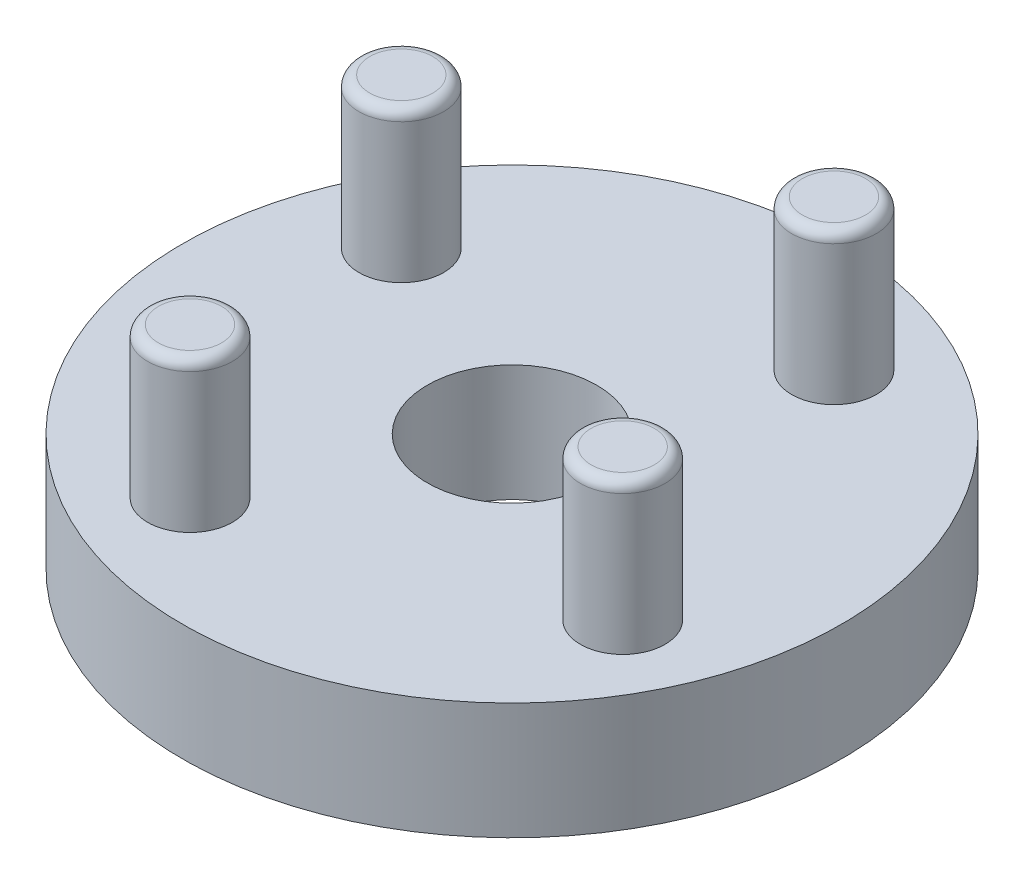
ISO-10303-21;
HEADER;
FILE_DESCRIPTION(('STEP AP214'),'2;1');
FILE_NAME('part.step','',(''),(''),'','','');
FILE_SCHEMA(('AUTOMOTIVE_DESIGN { 1 0 10303 214 1 1 1 1 }'));
ENDSEC;
DATA;
#1=APPLICATION_CONTEXT('core data for automotive mechanical design processes');
#2=APPLICATION_PROTOCOL_DEFINITION('international standard','automotive_design',2000,#1);
#3=PRODUCT_CONTEXT('',#1,'mechanical');
#4=PRODUCT('Part','Part','',(#3));
#5=PRODUCT_RELATED_PRODUCT_CATEGORY('part','',(#4));
#6=PRODUCT_DEFINITION_FORMATION('','',#4);
#7=PRODUCT_DEFINITION_CONTEXT('part definition',#1,'design');
#8=PRODUCT_DEFINITION('design','',#6,#7);
#9=PRODUCT_DEFINITION_SHAPE('','',#8);
#10=(LENGTH_UNIT() NAMED_UNIT(*) SI_UNIT(.MILLI.,.METRE.));
#11=(NAMED_UNIT(*) PLANE_ANGLE_UNIT() SI_UNIT($,.RADIAN.));
#12=(NAMED_UNIT(*) SI_UNIT($,.STERADIAN.) SOLID_ANGLE_UNIT());
#13=UNCERTAINTY_MEASURE_WITH_UNIT(LENGTH_MEASURE(1.E-05),#10,'distance_accuracy_value','');
#14=(GEOMETRIC_REPRESENTATION_CONTEXT(3) GLOBAL_UNCERTAINTY_ASSIGNED_CONTEXT((#13)) GLOBAL_UNIT_ASSIGNED_CONTEXT((#10,
#11,#12)) REPRESENTATION_CONTEXT('',''));
#15=CARTESIAN_POINT('',(0.,0.,0.));
#16=DIRECTION('',(0.,0.,1.));
#17=DIRECTION('',(1.,0.,0.));
#18=AXIS2_PLACEMENT_3D('',#15,#16,#17);
#19=CARTESIAN_POINT('',(35.0287277843954,26.2000967137347,35.8945010467193));
#20=DIRECTION('',(0.,1.,0.));
#21=DIRECTION('',(1.,0.,0.));
#22=AXIS2_PLACEMENT_3D('',#19,#20,#21);
#23=PLANE('',#22);
#24=CARTESIAN_POINT('',(35.0287277845122,26.2000967139887,35.8945010470589));
#25=DIRECTION('',(0.,1.,0.));
#26=DIRECTION('',(-0.89859436733959,0.,-0.438780312896513));
#27=AXIS2_PLACEMENT_3D('',#24,#25,#26);
#28=CIRCLE('',#27,1.492250000254);
#29=CARTESIAN_POINT('',(33.6878003396215,26.2000967139887,35.2397311250277));
#30=VERTEX_POINT('',#29);
#31=EDGE_CURVE('E99',#30,#30,#28,.T.);
#32=ORIENTED_EDGE('',*,*,#31,.T.);
#33=EDGE_LOOP('',(#32));
#34=FACE_BOUND('',#33,.T.);
#35=ADVANCED_FACE('F17',(#34),#23,.T.);
#36=CARTESIAN_POINT('',(29.8022513345682,26.2000967137347,20.6932317438155));
#37=DIRECTION('',(0.,1.,0.));
#38=DIRECTION('',(1.,0.,0.));
#39=AXIS2_PLACEMENT_3D('',#36,#37,#38);
#40=PLANE('',#39);
#41=CARTESIAN_POINT('',(29.8022513346797,26.2000967139887,20.6932317435873));
#42=DIRECTION('',(0.,1.,0.));
#43=DIRECTION('',(-0.89859436733959,0.,-0.438780312896513));
#44=AXIS2_PLACEMENT_3D('',#41,#42,#43);
#45=CIRCLE('',#44,1.492250000254);
#46=CARTESIAN_POINT('',(28.461323889789,26.2000967139887,20.038461821556));
#47=VERTEX_POINT('',#46);
#48=EDGE_CURVE('E108',#47,#47,#45,.T.);
#49=ORIENTED_EDGE('',*,*,#48,.T.);
#50=EDGE_LOOP('',(#49));
#51=FACE_BOUND('',#50,.T.);
#52=ADVANCED_FACE('F308',(#51),#40,.T.);
#53=CARTESIAN_POINT('',(14.6009820316646,26.2000967137347,25.9197081936427));
#54=DIRECTION('',(0.,1.,0.));
#55=DIRECTION('',(1.,0.,0.));
#56=AXIS2_PLACEMENT_3D('',#53,#54,#55);
#57=PLANE('',#56);
#58=CARTESIAN_POINT('',(14.6009820315478,26.2000967139887,25.919708193303));
#59=DIRECTION('',(0.,1.,0.));
#60=DIRECTION('',(-0.89859436733959,0.,-0.438780312896513));
#61=AXIS2_PLACEMENT_3D('',#58,#59,#60);
#62=CIRCLE('',#61,1.492250000254);
#63=CARTESIAN_POINT('',(13.2600545866571,26.2000967139887,25.2649382712717));
#64=VERTEX_POINT('',#63);
#65=EDGE_CURVE('E125',#64,#64,#62,.T.);
#66=ORIENTED_EDGE('',*,*,#65,.T.);
#67=EDGE_LOOP('',(#66));
#68=FACE_BOUND('',#67,.T.);
#69=ADVANCED_FACE('F299',(#68),#57,.T.);
#70=CARTESIAN_POINT('',(19.8274584814918,26.2000967137347,41.1209774965464));
#71=DIRECTION('',(0.,1.,0.));
#72=DIRECTION('',(1.,0.,0.));
#73=AXIS2_PLACEMENT_3D('',#70,#71,#72);
#74=PLANE('',#73);
#75=CARTESIAN_POINT('',(19.8274584813804,26.2000967139887,41.1209774967747));
#76=DIRECTION('',(0.,1.,0.));
#77=DIRECTION('',(-0.89859436733959,0.,-0.438780312896513));
#78=AXIS2_PLACEMENT_3D('',#75,#76,#77);
#79=CIRCLE('',#78,1.492250000254);
#80=CARTESIAN_POINT('',(18.4865310364897,26.2000967139887,40.4662075747434));
#81=VERTEX_POINT('',#80);
#82=EDGE_CURVE('E114',#81,#81,#79,.T.);
#83=ORIENTED_EDGE('',*,*,#82,.T.);
#84=EDGE_LOOP('',(#83));
#85=FACE_BOUND('',#84,.T.);
#86=ADVANCED_FACE('F288',(#85),#74,.T.);
#87=CARTESIAN_POINT('',(24.81485490803,13.6054968077347,30.9071046201809));
#88=DIRECTION('',(0.,1.,0.));
#89=DIRECTION('',(1.,0.,0.));
#90=AXIS2_PLACEMENT_3D('',#87,#88,#89);
#91=PLANE('',#90);
#92=CARTESIAN_POINT('',(24.81485490803,13.6054968077347,30.9071046201809));
#93=DIRECTION('',(0.,1.,0.));
#94=DIRECTION('',(-0.89859436733959,0.,-0.438780312896513));
#95=AXIS2_PLACEMENT_3D('',#92,#93,#94);
#96=CIRCLE('',#95,4.000000000254);
#97=CARTESIAN_POINT('',(21.2204774384434,13.6054968077347,29.1519833684834));
#98=VERTEX_POINT('',#97);
#99=EDGE_CURVE('E140',#98,#98,#96,.T.);
#100=ORIENTED_EDGE('',*,*,#99,.T.);
#101=EDGE_LOOP('',(#100));
#102=FACE_BOUND('',#101,.T.);
#103=CARTESIAN_POINT('',(24.81485490803,13.6054968077347,30.9071046201809));
#104=DIRECTION('',(0.,1.,0.));
#105=DIRECTION('',(-0.89859436733959,0.,-0.438780312896513));
#106=AXIS2_PLACEMENT_3D('',#103,#104,#105);
#107=CIRCLE('',#106,15.557500000254);
#108=CARTESIAN_POINT('',(10.8349730379161,13.6054968077347,24.080779902182));
#109=VERTEX_POINT('',#108);
#110=EDGE_CURVE('E20',#109,#109,#107,.T.);
#111=ORIENTED_EDGE('',*,*,#110,.F.);
#112=EDGE_LOOP('',(#111));
#113=FACE_BOUND('',#112,.T.);
#114=ADVANCED_FACE('F276',(#102,#113),#91,.F.);
#115=CARTESIAN_POINT('',(24.81485490803,19.1134967137347,30.9071046201809));
#116=DIRECTION('',(0.,1.,0.));
#117=DIRECTION('',(1.,0.,0.));
#118=AXIS2_PLACEMENT_3D('',#115,#116,#117);
#119=PLANE('',#118);
#120=CARTESIAN_POINT('',(24.81485490803,19.1134967139887,30.9071046201809));
#121=DIRECTION('',(0.,1.,0.));
#122=DIRECTION('',(-0.89859436733959,0.,-0.438780312896513));
#123=AXIS2_PLACEMENT_3D('',#120,#121,#122);
#124=CIRCLE('',#123,4.000000000254);
#125=CARTESIAN_POINT('',(21.2204774384434,19.1134967139887,29.1519833684834));
#126=VERTEX_POINT('',#125);
#127=EDGE_CURVE('E142',#126,#126,#124,.T.);
#128=ORIENTED_EDGE('',*,*,#127,.F.);
#129=EDGE_LOOP('',(#128));
#130=FACE_BOUND('',#129,.T.);
#131=CARTESIAN_POINT('',(19.8274584813804,19.1134967139887,41.1209774967747));
#132=DIRECTION('',(0.,1.,0.));
#133=DIRECTION('',(-0.89859436733959,0.,-0.438780312896513));
#134=AXIS2_PLACEMENT_3D('',#131,#132,#133);
#135=CIRCLE('',#134,2.000250000254);
#136=CARTESIAN_POINT('',(18.0300450978811,19.1134967139887,40.2433071757919));
#137=VERTEX_POINT('',#136);
#138=EDGE_CURVE('E137',#137,#137,#135,.T.);
#139=ORIENTED_EDGE('',*,*,#138,.F.);
#140=EDGE_LOOP('',(#139));
#141=FACE_BOUND('',#140,.T.);
#142=CARTESIAN_POINT('',(14.6009820315478,19.1134967139887,25.919708193303));
#143=DIRECTION('',(0.,1.,0.));
#144=DIRECTION('',(0.438780313010623,0.,-0.89859436728387));
#145=AXIS2_PLACEMENT_3D('',#142,#143,#144);
#146=CIRCLE('',#145,2.000250000254);
#147=CARTESIAN_POINT('',(15.4786523527588,19.1134967139887,24.1222948099152));
#148=VERTEX_POINT('',#147);
#149=EDGE_CURVE('E118',#148,#148,#146,.T.);
#150=ORIENTED_EDGE('',*,*,#149,.F.);
#151=EDGE_LOOP('',(#150));
#152=FACE_BOUND('',#151,.T.);
#153=CARTESIAN_POINT('',(29.8022513346797,19.1134967139887,20.6932317435873));
#154=DIRECTION('',(0.,1.,0.));
#155=DIRECTION('',(0.89859436733959,0.,0.438780312896513));
#156=AXIS2_PLACEMENT_3D('',#153,#154,#155);
#157=CIRCLE('',#156,2.000250000254);
#158=CARTESIAN_POINT('',(31.599664718179,19.1134967139887,21.5709020645699));
#159=VERTEX_POINT('',#158);
#160=EDGE_CURVE('E119',#159,#159,#157,.T.);
#161=ORIENTED_EDGE('',*,*,#160,.F.);
#162=EDGE_LOOP('',(#161));
#163=FACE_BOUND('',#162,.T.);
#164=CARTESIAN_POINT('',(35.0287277845122,19.1134967139887,35.8945010470589));
#165=DIRECTION('',(0.,1.,0.));
#166=DIRECTION('',(-0.438780313010629,0.,0.898594367283868));
#167=AXIS2_PLACEMENT_3D('',#164,#165,#166);
#168=CIRCLE('',#167,2.000250000254);
#169=CARTESIAN_POINT('',(34.1510574633013,19.1134967139887,37.6919144304467));
#170=VERTEX_POINT('',#169);
#171=EDGE_CURVE('E122',#170,#170,#168,.T.);
#172=ORIENTED_EDGE('',*,*,#171,.F.);
#173=EDGE_LOOP('',(#172));
#174=FACE_BOUND('',#173,.T.);
#175=CARTESIAN_POINT('',(24.81485490803,19.1134967139887,30.9071046201809));
#176=DIRECTION('',(0.,1.,0.));
#177=DIRECTION('',(-0.89859436733959,0.,-0.438780312896513));
#178=AXIS2_PLACEMENT_3D('',#175,#176,#177);
#179=CIRCLE('',#178,15.557500000254);
#180=CARTESIAN_POINT('',(10.8349730379161,19.1134967139887,24.080779902182));
#181=VERTEX_POINT('',#180);
#182=EDGE_CURVE('E11',#181,#181,#179,.T.);
#183=ORIENTED_EDGE('',*,*,#182,.T.);
#184=EDGE_LOOP('',(#183));
#185=FACE_BOUND('',#184,.T.);
#186=ADVANCED_FACE('F266',(#130,#141,#152,#163,#174,#185),#119,.T.);
#187=CARTESIAN_POINT('',(24.81485490803,19.1134967137347,30.9071046201809));
#188=DIRECTION('',(0.,-1.,0.));
#189=DIRECTION('',(0.89859436733959,0.,0.438780312896513));
#190=AXIS2_PLACEMENT_3D('',#187,#188,#189);
#191=CYLINDRICAL_SURFACE('',#190,15.5575);
#192=ORIENTED_EDGE('',*,*,#182,.F.);
#193=EDGE_LOOP('',(#192));
#194=FACE_BOUND('',#193,.T.);
#195=ORIENTED_EDGE('',*,*,#110,.T.);
#196=EDGE_LOOP('',(#195));
#197=FACE_BOUND('',#196,.T.);
#198=ADVANCED_FACE('F257',(#194,#197),#191,.T.);
#199=CARTESIAN_POINT('',(24.81485490803,19.1134967137347,30.9071046201809));
#200=DIRECTION('',(0.,-1.,0.));
#201=DIRECTION('',(0.89859436733959,0.,0.438780312896513));
#202=AXIS2_PLACEMENT_3D('',#199,#200,#201);
#203=CYLINDRICAL_SURFACE('',#202,4.);
#204=ORIENTED_EDGE('',*,*,#127,.T.);
#205=EDGE_LOOP('',(#204));
#206=FACE_BOUND('',#205,.T.);
#207=ORIENTED_EDGE('',*,*,#99,.F.);
#208=EDGE_LOOP('',(#207));
#209=FACE_BOUND('',#208,.T.);
#210=ADVANCED_FACE('F246',(#206,#209),#203,.F.);
#211=CARTESIAN_POINT('',(19.8274584814918,26.2000967137347,41.1209774965464));
#212=DIRECTION('',(0.,-1.,0.));
#213=DIRECTION('',(0.89859436733959,0.,0.438780312896513));
#214=AXIS2_PLACEMENT_3D('',#211,#212,#213);
#215=CYLINDRICAL_SURFACE('',#214,2.00025);
#216=CARTESIAN_POINT('',(19.8274584813804,25.6920967139887,41.1209774967747));
#217=DIRECTION('',(0.,-1.,0.));
#218=DIRECTION('',(-0.89859436733959,0.,-0.438780312896513));
#219=AXIS2_PLACEMENT_3D('',#216,#217,#218);
#220=CIRCLE('',#219,2.000250000254);
#221=CARTESIAN_POINT('',(18.0300450978811,25.6920967139887,40.2433071757919));
#222=VERTEX_POINT('',#221);
#223=EDGE_CURVE('E117',#222,#222,#220,.T.);
#224=ORIENTED_EDGE('',*,*,#223,.T.);
#225=EDGE_LOOP('',(#224));
#226=FACE_BOUND('',#225,.T.);
#227=ORIENTED_EDGE('',*,*,#138,.T.);
#228=EDGE_LOOP('',(#227));
#229=FACE_BOUND('',#228,.T.);
#230=ADVANCED_FACE('F235',(#226,#229),#215,.T.);
#231=CARTESIAN_POINT('',(19.8274584814918,25.6920967137346,41.1209774965464));
#232=DIRECTION('',(0.,1.,0.));
#233=DIRECTION('',(-0.89859436733959,0.,-0.438780312896513));
#234=AXIS2_PLACEMENT_3D('',#231,#232,#233);
#235=TOROIDAL_SURFACE('',#234,1.49225,0.508);
#236=ORIENTED_EDGE('',*,*,#223,.F.);
#237=EDGE_LOOP('',(#236));
#238=FACE_BOUND('',#237,.T.);
#239=ORIENTED_EDGE('',*,*,#82,.F.);
#240=EDGE_LOOP('',(#239));
#241=FACE_BOUND('',#240,.T.);
#242=ADVANCED_FACE('F224',(#238,#241),#235,.T.);
#243=CARTESIAN_POINT('',(14.6009820316646,26.2000967137347,25.9197081936427));
#244=DIRECTION('',(0.,-1.,0.));
#245=DIRECTION('',(0.89859436733959,0.,0.438780312896513));
#246=AXIS2_PLACEMENT_3D('',#243,#244,#245);
#247=CYLINDRICAL_SURFACE('',#246,2.00025);
#248=CARTESIAN_POINT('',(14.6009820315478,25.6920967139887,25.919708193303));
#249=DIRECTION('',(0.,-1.,0.));
#250=DIRECTION('',(-0.89859436733959,0.,-0.438780312896513));
#251=AXIS2_PLACEMENT_3D('',#248,#249,#250);
#252=CIRCLE('',#251,2.000250000254);
#253=CARTESIAN_POINT('',(12.8035686480486,25.6920967139887,25.0420378723203));
#254=VERTEX_POINT('',#253);
#255=EDGE_CURVE('E127',#254,#254,#252,.T.);
#256=ORIENTED_EDGE('',*,*,#255,.T.);
#257=EDGE_LOOP('',(#256));
#258=FACE_BOUND('',#257,.T.);
#259=ORIENTED_EDGE('',*,*,#149,.T.);
#260=EDGE_LOOP('',(#259));
#261=FACE_BOUND('',#260,.T.);
#262=ADVANCED_FACE('F213',(#258,#261),#247,.T.);
#263=CARTESIAN_POINT('',(29.8022513345682,26.2000967137347,20.6932317438155));
#264=DIRECTION('',(0.,-1.,0.));
#265=DIRECTION('',(0.89859436733959,0.,0.438780312896513));
#266=AXIS2_PLACEMENT_3D('',#263,#264,#265);
#267=CYLINDRICAL_SURFACE('',#266,2.00025);
#268=CARTESIAN_POINT('',(29.8022513346797,25.6920967139887,20.6932317435873));
#269=DIRECTION('',(0.,-1.,0.));
#270=DIRECTION('',(-0.89859436733959,0.,-0.438780312896513));
#271=AXIS2_PLACEMENT_3D('',#268,#269,#270);
#272=CIRCLE('',#271,2.000250000254);
#273=CARTESIAN_POINT('',(28.0048379511804,25.6920967139887,19.8155614226046));
#274=VERTEX_POINT('',#273);
#275=EDGE_CURVE('E113',#274,#274,#272,.T.);
#276=ORIENTED_EDGE('',*,*,#275,.T.);
#277=EDGE_LOOP('',(#276));
#278=FACE_BOUND('',#277,.T.);
#279=ORIENTED_EDGE('',*,*,#160,.T.);
#280=EDGE_LOOP('',(#279));
#281=FACE_BOUND('',#280,.T.);
#282=ADVANCED_FACE('F201',(#278,#281),#267,.T.);
#283=CARTESIAN_POINT('',(35.0287277843954,26.2000967137347,35.8945010467193));
#284=DIRECTION('',(0.,-1.,0.));
#285=DIRECTION('',(0.89859436733959,0.,0.438780312896513));
#286=AXIS2_PLACEMENT_3D('',#283,#284,#285);
#287=CYLINDRICAL_SURFACE('',#286,2.00025);
#288=CARTESIAN_POINT('',(35.0287277845122,25.6920967139887,35.8945010470589));
#289=DIRECTION('',(0.,-1.,0.));
#290=DIRECTION('',(-0.89859436733959,0.,-0.438780312896513));
#291=AXIS2_PLACEMENT_3D('',#288,#289,#290);
#292=CIRCLE('',#291,2.000250000254);
#293=CARTESIAN_POINT('',(33.231314401013,25.6920967139887,35.0168307260762));
#294=VERTEX_POINT('',#293);
#295=EDGE_CURVE('E102',#294,#294,#292,.T.);
#296=ORIENTED_EDGE('',*,*,#295,.T.);
#297=EDGE_LOOP('',(#296));
#298=FACE_BOUND('',#297,.T.);
#299=ORIENTED_EDGE('',*,*,#171,.T.);
#300=EDGE_LOOP('',(#299));
#301=FACE_BOUND('',#300,.T.);
#302=ADVANCED_FACE('F189',(#298,#301),#287,.T.);
#303=CARTESIAN_POINT('',(14.6009820316646,25.6920967137346,25.9197081936427));
#304=DIRECTION('',(0.,1.,0.));
#305=DIRECTION('',(-0.89859436733959,0.,-0.438780312896513));
#306=AXIS2_PLACEMENT_3D('',#303,#304,#305);
#307=TOROIDAL_SURFACE('',#306,1.49225,0.508);
#308=ORIENTED_EDGE('',*,*,#255,.F.);
#309=EDGE_LOOP('',(#308));
#310=FACE_BOUND('',#309,.T.);
#311=ORIENTED_EDGE('',*,*,#65,.F.);
#312=EDGE_LOOP('',(#311));
#313=FACE_BOUND('',#312,.T.);
#314=ADVANCED_FACE('F177',(#310,#313),#307,.T.);
#315=CARTESIAN_POINT('',(29.8022513345682,25.6920967137346,20.6932317438155));
#316=DIRECTION('',(0.,1.,0.));
#317=DIRECTION('',(-0.89859436733959,0.,-0.438780312896513));
#318=AXIS2_PLACEMENT_3D('',#315,#316,#317);
#319=TOROIDAL_SURFACE('',#318,1.49225,0.508);
#320=ORIENTED_EDGE('',*,*,#275,.F.);
#321=EDGE_LOOP('',(#320));
#322=FACE_BOUND('',#321,.T.);
#323=ORIENTED_EDGE('',*,*,#48,.F.);
#324=EDGE_LOOP('',(#323));
#325=FACE_BOUND('',#324,.T.);
#326=ADVANCED_FACE('F165',(#322,#325),#319,.T.);
#327=CARTESIAN_POINT('',(35.0287277843954,25.6920967137346,35.8945010467193));
#328=DIRECTION('',(0.,1.,0.));
#329=DIRECTION('',(-0.89859436733959,0.,-0.438780312896513));
#330=AXIS2_PLACEMENT_3D('',#327,#328,#329);
#331=TOROIDAL_SURFACE('',#330,1.49225,0.508);
#332=ORIENTED_EDGE('',*,*,#295,.F.);
#333=EDGE_LOOP('',(#332));
#334=FACE_BOUND('',#333,.T.);
#335=ORIENTED_EDGE('',*,*,#31,.F.);
#336=EDGE_LOOP('',(#335));
#337=FACE_BOUND('',#336,.T.);
#338=ADVANCED_FACE('F160',(#334,#337),#331,.T.);
#339=CLOSED_SHELL('',(#35,#52,#69,#86,#114,#186,#198,#210,#230,#242,#262,#282,#302,#314,#326,#338));
#340=MANIFOLD_SOLID_BREP('B1',#339);
#341=ADVANCED_BREP_SHAPE_REPRESENTATION('',(#18,#340),#14);
#342=SHAPE_DEFINITION_REPRESENTATION(#9,#341);
ENDSEC;
END-ISO-10303-21;
